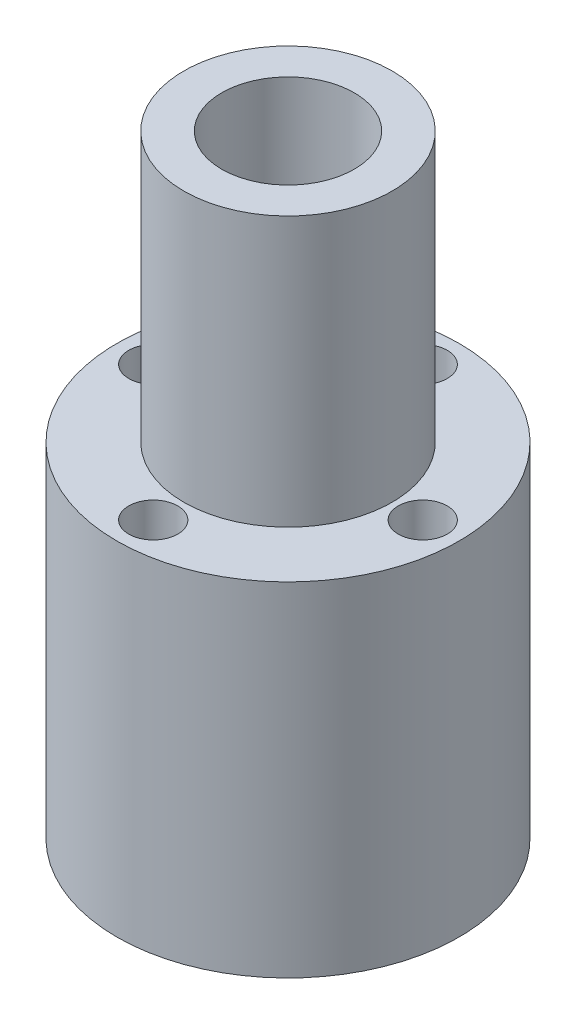
ISO-10303-21;
HEADER;
FILE_DESCRIPTION(('STEP AP214'),'2;1');
FILE_NAME('part.step','',(''),(''),'','','');
FILE_SCHEMA(('AUTOMOTIVE_DESIGN { 1 0 10303 214 1 1 1 1 }'));
ENDSEC;
DATA;
#1=APPLICATION_CONTEXT('core data for automotive mechanical design processes');
#2=APPLICATION_PROTOCOL_DEFINITION('international standard','automotive_design',2000,#1);
#3=PRODUCT_CONTEXT('',#1,'mechanical');
#4=PRODUCT('Part','Part','',(#3));
#5=PRODUCT_RELATED_PRODUCT_CATEGORY('part','',(#4));
#6=PRODUCT_DEFINITION_FORMATION('','',#4);
#7=PRODUCT_DEFINITION_CONTEXT('part definition',#1,'design');
#8=PRODUCT_DEFINITION('design','',#6,#7);
#9=PRODUCT_DEFINITION_SHAPE('','',#8);
#10=(LENGTH_UNIT() NAMED_UNIT(*) SI_UNIT(.MILLI.,.METRE.));
#11=(NAMED_UNIT(*) PLANE_ANGLE_UNIT() SI_UNIT($,.RADIAN.));
#12=(NAMED_UNIT(*) SI_UNIT($,.STERADIAN.) SOLID_ANGLE_UNIT());
#13=UNCERTAINTY_MEASURE_WITH_UNIT(LENGTH_MEASURE(1.E-05),#10,'distance_accuracy_value','');
#14=(GEOMETRIC_REPRESENTATION_CONTEXT(3) GLOBAL_UNCERTAINTY_ASSIGNED_CONTEXT((#13)) GLOBAL_UNIT_ASSIGNED_CONTEXT((#10,
#11,#12)) REPRESENTATION_CONTEXT('',''));
#15=CARTESIAN_POINT('',(0.,0.,0.));
#16=DIRECTION('',(0.,0.,1.));
#17=DIRECTION('',(1.,0.,0.));
#18=AXIS2_PLACEMENT_3D('',#15,#16,#17);
#19=CARTESIAN_POINT('',(0.,11.,0.));
#20=DIRECTION('',(0.,1.,0.));
#21=DIRECTION('',(0.,0.,1.));
#22=AXIS2_PLACEMENT_3D('',#19,#20,#21);
#23=PLANE('',#22);
#24=CARTESIAN_POINT('',(0.,11.,0.));
#25=DIRECTION('',(0.,1.,0.));
#26=DIRECTION('',(0.,0.,1.));
#27=AXIS2_PLACEMENT_3D('',#24,#25,#26);
#28=CIRCLE('',#27,4.25);
#29=CARTESIAN_POINT('',(0.,11.,4.25));
#30=VERTEX_POINT('',#29);
#31=EDGE_CURVE('E10',#30,#30,#28,.T.);
#32=ORIENTED_EDGE('',*,*,#31,.T.);
#33=EDGE_LOOP('',(#32));
#34=FACE_BOUND('',#33,.T.);
#35=CARTESIAN_POINT('',(0.,11.,0.));
#36=DIRECTION('',(0.,1.,0.));
#37=DIRECTION('',(0.,0.,1.));
#38=AXIS2_PLACEMENT_3D('',#35,#36,#37);
#39=CIRCLE('',#38,2.7051);
#40=CARTESIAN_POINT('',(0.,11.,2.7051));
#41=VERTEX_POINT('',#40);
#42=EDGE_CURVE('E39',#41,#41,#39,.T.);
#43=ORIENTED_EDGE('',*,*,#42,.F.);
#44=EDGE_LOOP('',(#43));
#45=FACE_BOUND('',#44,.T.);
#46=ADVANCED_FACE('F31',(#34,#45),#23,.T.);
#47=CARTESIAN_POINT('',(0.,11.,0.));
#48=DIRECTION('',(0.,-1.,0.));
#49=DIRECTION('',(0.,0.,-1.));
#50=AXIS2_PLACEMENT_3D('',#47,#48,#49);
#51=CYLINDRICAL_SURFACE('',#50,4.25);
#52=ORIENTED_EDGE('',*,*,#31,.F.);
#53=EDGE_LOOP('',(#52));
#54=FACE_BOUND('',#53,.T.);
#55=CARTESIAN_POINT('',(0.,0.,0.));
#56=DIRECTION('',(0.,1.,0.));
#57=DIRECTION('',(0.,0.,1.));
#58=AXIS2_PLACEMENT_3D('',#55,#56,#57);
#59=CIRCLE('',#58,4.25);
#60=CARTESIAN_POINT('',(0.,0.,4.25));
#61=VERTEX_POINT('',#60);
#62=EDGE_CURVE('E47',#61,#61,#59,.T.);
#63=ORIENTED_EDGE('',*,*,#62,.T.);
#64=EDGE_LOOP('',(#63));
#65=FACE_BOUND('',#64,.T.);
#66=ADVANCED_FACE('F33',(#54,#65),#51,.T.);
#67=CARTESIAN_POINT('',(0.,11.,0.));
#68=DIRECTION('',(0.,-1.,0.));
#69=DIRECTION('',(0.,0.,-1.));
#70=AXIS2_PLACEMENT_3D('',#67,#68,#69);
#71=CYLINDRICAL_SURFACE('',#70,2.7051);
#72=ORIENTED_EDGE('',*,*,#42,.T.);
#73=EDGE_LOOP('',(#72));
#74=FACE_BOUND('',#73,.T.);
#75=CARTESIAN_POINT('',(0.,0.,0.));
#76=DIRECTION('',(0.,1.,0.));
#77=DIRECTION('',(0.,0.,1.));
#78=AXIS2_PLACEMENT_3D('',#75,#76,#77);
#79=CIRCLE('',#78,2.7051);
#80=CARTESIAN_POINT('',(0.,0.,2.7051));
#81=VERTEX_POINT('',#80);
#82=EDGE_CURVE('E44',#81,#81,#79,.T.);
#83=ORIENTED_EDGE('',*,*,#82,.F.);
#84=EDGE_LOOP('',(#83));
#85=FACE_BOUND('',#84,.T.);
#86=ADVANCED_FACE('F119',(#74,#85),#71,.F.);
#87=CARTESIAN_POINT('',(0.,0.,0.));
#88=DIRECTION('',(0.,1.,0.));
#89=DIRECTION('',(0.,0.,1.));
#90=AXIS2_PLACEMENT_3D('',#87,#88,#89);
#91=PLANE('',#90);
#92=CARTESIAN_POINT('',(0.,0.,0.));
#93=DIRECTION('',(0.,1.,0.));
#94=DIRECTION('',(0.,0.,1.));
#95=AXIS2_PLACEMENT_3D('',#92,#93,#94);
#96=CIRCLE('',#95,1.75);
#97=CARTESIAN_POINT('',(0.,0.,1.75));
#98=VERTEX_POINT('',#97);
#99=EDGE_CURVE('E59',#98,#98,#96,.T.);
#100=ORIENTED_EDGE('',*,*,#99,.F.);
#101=EDGE_LOOP('',(#100));
#102=FACE_BOUND('',#101,.T.);
#103=ORIENTED_EDGE('',*,*,#82,.T.);
#104=EDGE_LOOP('',(#103));
#105=FACE_BOUND('',#104,.T.);
#106=ADVANCED_FACE('F125',(#102,#105),#91,.T.);
#107=CARTESIAN_POINT('',(0.,-14.,0.));
#108=DIRECTION('',(0.,1.,0.));
#109=DIRECTION('',(0.,0.,1.));
#110=AXIS2_PLACEMENT_3D('',#107,#108,#109);
#111=CYLINDRICAL_SURFACE('',#110,6.985);
#112=CARTESIAN_POINT('',(0.,-14.,0.));
#113=DIRECTION('',(0.,1.,0.));
#114=DIRECTION('',(0.,0.,1.));
#115=AXIS2_PLACEMENT_3D('',#112,#113,#114);
#116=CIRCLE('',#115,6.985);
#117=CARTESIAN_POINT('',(0.,-14.,6.985));
#118=VERTEX_POINT('',#117);
#119=EDGE_CURVE('E49',#118,#118,#116,.T.);
#120=ORIENTED_EDGE('',*,*,#119,.T.);
#121=EDGE_LOOP('',(#120));
#122=FACE_BOUND('',#121,.T.);
#123=CARTESIAN_POINT('',(0.,0.,0.));
#124=DIRECTION('',(0.,1.,0.));
#125=DIRECTION('',(0.,0.,1.));
#126=AXIS2_PLACEMENT_3D('',#123,#124,#125);
#127=CIRCLE('',#126,6.985);
#128=CARTESIAN_POINT('',(0.,0.,6.985));
#129=VERTEX_POINT('',#128);
#130=EDGE_CURVE('E54',#129,#129,#127,.T.);
#131=ORIENTED_EDGE('',*,*,#130,.F.);
#132=EDGE_LOOP('',(#131));
#133=FACE_BOUND('',#132,.T.);
#134=ADVANCED_FACE('F127',(#122,#133),#111,.T.);
#135=CARTESIAN_POINT('',(0.,-14.,0.));
#136=DIRECTION('',(0.,1.,0.));
#137=DIRECTION('',(0.,0.,1.));
#138=AXIS2_PLACEMENT_3D('',#135,#136,#137);
#139=PLANE('',#138);
#140=CARTESIAN_POINT('',(0.,-14.,0.));
#141=DIRECTION('',(0.,1.,0.));
#142=DIRECTION('',(0.,0.,1.));
#143=AXIS2_PLACEMENT_3D('',#140,#141,#142);
#144=CIRCLE('',#143,2.1);
#145=CARTESIAN_POINT('',(0.,-14.,2.1));
#146=VERTEX_POINT('',#145);
#147=EDGE_CURVE('E88',#146,#146,#144,.T.);
#148=ORIENTED_EDGE('',*,*,#147,.T.);
#149=EDGE_LOOP('',(#148));
#150=FACE_BOUND('',#149,.T.);
#151=CARTESIAN_POINT('',(-5.5,-14.,0.));
#152=DIRECTION('',(0.,1.,0.));
#153=DIRECTION('',(0.,0.,1.));
#154=AXIS2_PLACEMENT_3D('',#151,#152,#153);
#155=CIRCLE('',#154,1.);
#156=CARTESIAN_POINT('',(-5.5,-14.,1.));
#157=VERTEX_POINT('',#156);
#158=EDGE_CURVE('E80',#157,#157,#155,.T.);
#159=ORIENTED_EDGE('',*,*,#158,.T.);
#160=EDGE_LOOP('',(#159));
#161=FACE_BOUND('',#160,.T.);
#162=CARTESIAN_POINT('',(0.,-14.,5.5));
#163=DIRECTION('',(0.,1.,0.));
#164=DIRECTION('',(0.,0.,1.));
#165=AXIS2_PLACEMENT_3D('',#162,#163,#164);
#166=CIRCLE('',#165,1.);
#167=CARTESIAN_POINT('',(0.,-14.,6.5));
#168=VERTEX_POINT('',#167);
#169=EDGE_CURVE('E74',#168,#168,#166,.T.);
#170=ORIENTED_EDGE('',*,*,#169,.T.);
#171=EDGE_LOOP('',(#170));
#172=FACE_BOUND('',#171,.T.);
#173=CARTESIAN_POINT('',(5.5,-14.,0.));
#174=DIRECTION('',(0.,1.,0.));
#175=DIRECTION('',(0.,0.,1.));
#176=AXIS2_PLACEMENT_3D('',#173,#174,#175);
#177=CIRCLE('',#176,1.);
#178=CARTESIAN_POINT('',(5.5,-14.,1.));
#179=VERTEX_POINT('',#178);
#180=EDGE_CURVE('E68',#179,#179,#177,.T.);
#181=ORIENTED_EDGE('',*,*,#180,.T.);
#182=EDGE_LOOP('',(#181));
#183=FACE_BOUND('',#182,.T.);
#184=CARTESIAN_POINT('',(0.,-14.,-5.5));
#185=DIRECTION('',(0.,1.,0.));
#186=DIRECTION('',(0.,0.,1.));
#187=AXIS2_PLACEMENT_3D('',#184,#185,#186);
#188=CIRCLE('',#187,1.);
#189=CARTESIAN_POINT('',(0.,-14.,-4.5));
#190=VERTEX_POINT('',#189);
#191=EDGE_CURVE('E64',#190,#190,#188,.T.);
#192=ORIENTED_EDGE('',*,*,#191,.T.);
#193=EDGE_LOOP('',(#192));
#194=FACE_BOUND('',#193,.T.);
#195=ORIENTED_EDGE('',*,*,#119,.F.);
#196=EDGE_LOOP('',(#195));
#197=FACE_BOUND('',#196,.T.);
#198=ADVANCED_FACE('F130',(#150,#161,#172,#183,#194,#197),#139,.F.);
#199=ORIENTED_EDGE('',*,*,#62,.F.);
#200=EDGE_LOOP('',(#199));
#201=FACE_BOUND('',#200,.T.);
#202=CARTESIAN_POINT('',(-5.5,0.,0.));
#203=DIRECTION('',(0.,1.,0.));
#204=DIRECTION('',(0.,0.,1.));
#205=AXIS2_PLACEMENT_3D('',#202,#203,#204);
#206=CIRCLE('',#205,1.);
#207=CARTESIAN_POINT('',(-5.5,0.,1.));
#208=VERTEX_POINT('',#207);
#209=EDGE_CURVE('E83',#208,#208,#206,.T.);
#210=ORIENTED_EDGE('',*,*,#209,.F.);
#211=EDGE_LOOP('',(#210));
#212=FACE_BOUND('',#211,.T.);
#213=CARTESIAN_POINT('',(0.,0.,5.5));
#214=DIRECTION('',(0.,1.,0.));
#215=DIRECTION('',(0.,0.,1.));
#216=AXIS2_PLACEMENT_3D('',#213,#214,#215);
#217=CIRCLE('',#216,1.);
#218=CARTESIAN_POINT('',(0.,0.,6.5));
#219=VERTEX_POINT('',#218);
#220=EDGE_CURVE('E77',#219,#219,#217,.T.);
#221=ORIENTED_EDGE('',*,*,#220,.F.);
#222=EDGE_LOOP('',(#221));
#223=FACE_BOUND('',#222,.T.);
#224=CARTESIAN_POINT('',(5.5,0.,0.));
#225=DIRECTION('',(0.,1.,0.));
#226=DIRECTION('',(0.,0.,1.));
#227=AXIS2_PLACEMENT_3D('',#224,#225,#226);
#228=CIRCLE('',#227,1.);
#229=CARTESIAN_POINT('',(5.5,0.,1.));
#230=VERTEX_POINT('',#229);
#231=EDGE_CURVE('E71',#230,#230,#228,.T.);
#232=ORIENTED_EDGE('',*,*,#231,.F.);
#233=EDGE_LOOP('',(#232));
#234=FACE_BOUND('',#233,.T.);
#235=CARTESIAN_POINT('',(0.,0.,-5.5));
#236=DIRECTION('',(0.,1.,0.));
#237=DIRECTION('',(0.,0.,1.));
#238=AXIS2_PLACEMENT_3D('',#235,#236,#237);
#239=CIRCLE('',#238,1.);
#240=CARTESIAN_POINT('',(0.,0.,-4.5));
#241=VERTEX_POINT('',#240);
#242=EDGE_CURVE('E65',#241,#241,#239,.T.);
#243=ORIENTED_EDGE('',*,*,#242,.F.);
#244=EDGE_LOOP('',(#243));
#245=FACE_BOUND('',#244,.T.);
#246=ORIENTED_EDGE('',*,*,#130,.T.);
#247=EDGE_LOOP('',(#246));
#248=FACE_BOUND('',#247,.T.);
#249=ADVANCED_FACE('F131',(#201,#212,#223,#234,#245,#248),#91,.T.);
#250=CARTESIAN_POINT('',(0.,-14.,0.));
#251=DIRECTION('',(0.,1.,0.));
#252=DIRECTION('',(0.,0.,1.));
#253=AXIS2_PLACEMENT_3D('',#250,#251,#252);
#254=CYLINDRICAL_SURFACE('',#253,1.75);
#255=CARTESIAN_POINT('',(0.,-8.,0.));
#256=DIRECTION('',(0.,1.,0.));
#257=DIRECTION('',(0.,0.,1.));
#258=AXIS2_PLACEMENT_3D('',#255,#256,#257);
#259=CIRCLE('',#258,1.75);
#260=CARTESIAN_POINT('',(0.,-8.,1.75));
#261=VERTEX_POINT('',#260);
#262=EDGE_CURVE('E35',#261,#261,#259,.F.);
#263=ORIENTED_EDGE('',*,*,#262,.T.);
#264=EDGE_LOOP('',(#263));
#265=FACE_BOUND('',#264,.T.);
#266=ORIENTED_EDGE('',*,*,#99,.T.);
#267=EDGE_LOOP('',(#266));
#268=FACE_BOUND('',#267,.T.);
#269=ADVANCED_FACE('F98',(#265,#268),#254,.F.);
#270=CARTESIAN_POINT('',(0.,-14.,-5.5));
#271=DIRECTION('',(0.,1.,0.));
#272=DIRECTION('',(0.,0.,1.));
#273=AXIS2_PLACEMENT_3D('',#270,#271,#272);
#274=CYLINDRICAL_SURFACE('',#273,1.);
#275=ORIENTED_EDGE('',*,*,#191,.F.);
#276=EDGE_LOOP('',(#275));
#277=FACE_BOUND('',#276,.T.);
#278=ORIENTED_EDGE('',*,*,#242,.T.);
#279=EDGE_LOOP('',(#278));
#280=FACE_BOUND('',#279,.T.);
#281=ADVANCED_FACE('F140',(#277,#280),#274,.F.);
#282=CARTESIAN_POINT('',(5.5,-14.,0.));
#283=DIRECTION('',(0.,1.,0.));
#284=DIRECTION('',(0.,0.,1.));
#285=AXIS2_PLACEMENT_3D('',#282,#283,#284);
#286=CYLINDRICAL_SURFACE('',#285,1.);
#287=ORIENTED_EDGE('',*,*,#180,.F.);
#288=EDGE_LOOP('',(#287));
#289=FACE_BOUND('',#288,.T.);
#290=ORIENTED_EDGE('',*,*,#231,.T.);
#291=EDGE_LOOP('',(#290));
#292=FACE_BOUND('',#291,.T.);
#293=ADVANCED_FACE('F143',(#289,#292),#286,.F.);
#294=CARTESIAN_POINT('',(0.,-14.,5.5));
#295=DIRECTION('',(0.,1.,0.));
#296=DIRECTION('',(0.,0.,1.));
#297=AXIS2_PLACEMENT_3D('',#294,#295,#296);
#298=CYLINDRICAL_SURFACE('',#297,1.);
#299=ORIENTED_EDGE('',*,*,#169,.F.);
#300=EDGE_LOOP('',(#299));
#301=FACE_BOUND('',#300,.T.);
#302=ORIENTED_EDGE('',*,*,#220,.T.);
#303=EDGE_LOOP('',(#302));
#304=FACE_BOUND('',#303,.T.);
#305=ADVANCED_FACE('F112',(#301,#304),#298,.F.);
#306=CARTESIAN_POINT('',(-5.5,-14.,0.));
#307=DIRECTION('',(0.,1.,0.));
#308=DIRECTION('',(0.,0.,1.));
#309=AXIS2_PLACEMENT_3D('',#306,#307,#308);
#310=CYLINDRICAL_SURFACE('',#309,1.);
#311=ORIENTED_EDGE('',*,*,#158,.F.);
#312=EDGE_LOOP('',(#311));
#313=FACE_BOUND('',#312,.T.);
#314=ORIENTED_EDGE('',*,*,#209,.T.);
#315=EDGE_LOOP('',(#314));
#316=FACE_BOUND('',#315,.T.);
#317=ADVANCED_FACE('F104',(#313,#316),#310,.F.);
#318=CARTESIAN_POINT('',(0.,-8.,0.));
#319=DIRECTION('',(0.,1.,0.));
#320=DIRECTION('',(0.,0.,1.));
#321=AXIS2_PLACEMENT_3D('',#318,#319,#320);
#322=PLANE('',#321);
#323=CARTESIAN_POINT('',(0.,-8.,0.));
#324=DIRECTION('',(0.,1.,0.));
#325=DIRECTION('',(0.,0.,1.));
#326=AXIS2_PLACEMENT_3D('',#323,#324,#325);
#327=CIRCLE('',#326,2.1);
#328=CARTESIAN_POINT('',(0.,-8.,2.1));
#329=VERTEX_POINT('',#328);
#330=EDGE_CURVE('E91',#329,#329,#327,.T.);
#331=ORIENTED_EDGE('',*,*,#330,.F.);
#332=EDGE_LOOP('',(#331));
#333=FACE_BOUND('',#332,.T.);
#334=ORIENTED_EDGE('',*,*,#262,.F.);
#335=EDGE_LOOP('',(#334));
#336=FACE_BOUND('',#335,.T.);
#337=ADVANCED_FACE('F101',(#333,#336),#322,.F.);
#338=CARTESIAN_POINT('',(0.,-8.,0.));
#339=DIRECTION('',(0.,-1.,0.));
#340=DIRECTION('',(0.,0.,-1.));
#341=AXIS2_PLACEMENT_3D('',#338,#339,#340);
#342=CYLINDRICAL_SURFACE('',#341,2.1);
#343=ORIENTED_EDGE('',*,*,#330,.T.);
#344=EDGE_LOOP('',(#343));
#345=FACE_BOUND('',#344,.T.);
#346=ORIENTED_EDGE('',*,*,#147,.F.);
#347=EDGE_LOOP('',(#346));
#348=FACE_BOUND('',#347,.T.);
#349=ADVANCED_FACE('F103',(#345,#348),#342,.F.);
#350=CLOSED_SHELL('',(#46,#66,#86,#106,#134,#198,#249,#269,#281,#293,#305,#317,#337,#349));
#351=MANIFOLD_SOLID_BREP('B2',#350);
#352=ADVANCED_BREP_SHAPE_REPRESENTATION('',(#18,#351),#14);
#353=SHAPE_DEFINITION_REPRESENTATION(#9,#352);
ENDSEC;
END-ISO-10303-21;
